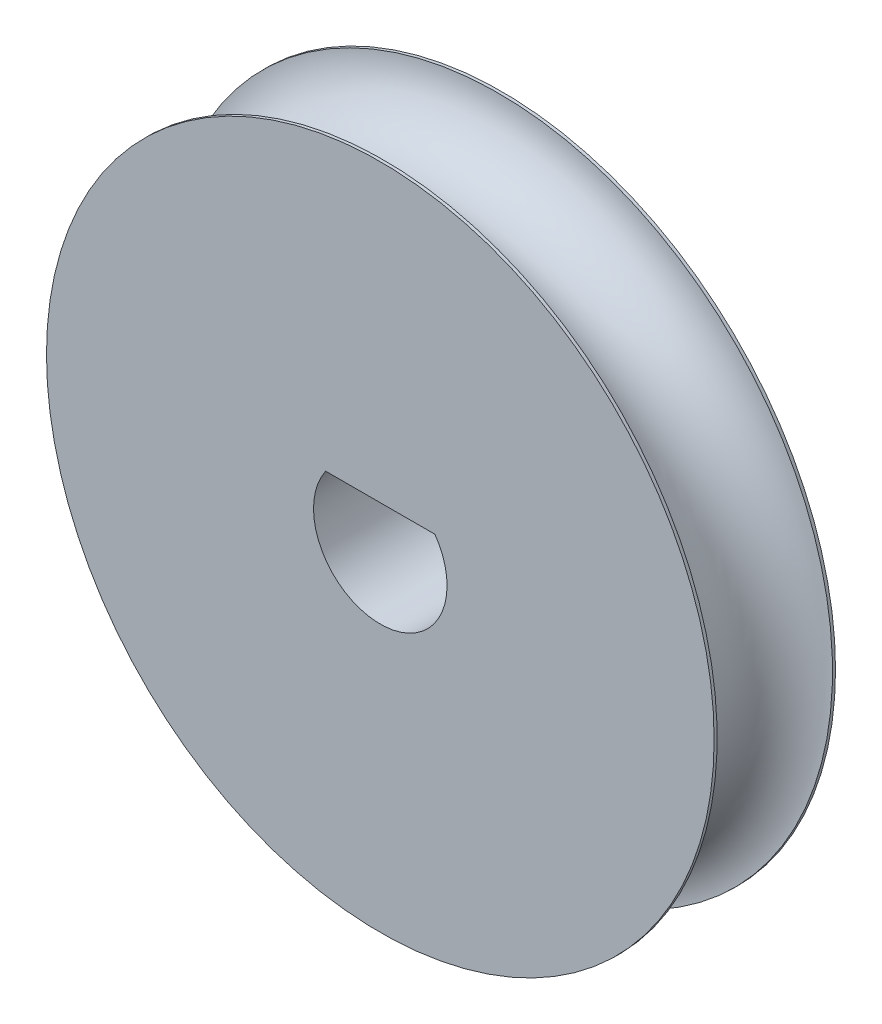
ISO-10303-21;
HEADER;
FILE_DESCRIPTION(('STEP AP214'),'2;1');
FILE_NAME('part.step','',(''),(''),'','','');
FILE_SCHEMA(('AUTOMOTIVE_DESIGN { 1 0 10303 214 1 1 1 1 }'));
ENDSEC;
DATA;
#1=APPLICATION_CONTEXT('core data for automotive mechanical design processes');
#2=APPLICATION_PROTOCOL_DEFINITION('international standard','automotive_design',2000,#1);
#3=PRODUCT_CONTEXT('',#1,'mechanical');
#4=PRODUCT('Part','Part','',(#3));
#5=PRODUCT_RELATED_PRODUCT_CATEGORY('part','',(#4));
#6=PRODUCT_DEFINITION_FORMATION('','',#4);
#7=PRODUCT_DEFINITION_CONTEXT('part definition',#1,'design');
#8=PRODUCT_DEFINITION('design','',#6,#7);
#9=PRODUCT_DEFINITION_SHAPE('','',#8);
#10=(LENGTH_UNIT() NAMED_UNIT(*) SI_UNIT(.MILLI.,.METRE.));
#11=(NAMED_UNIT(*) PLANE_ANGLE_UNIT() SI_UNIT($,.RADIAN.));
#12=(NAMED_UNIT(*) SI_UNIT($,.STERADIAN.) SOLID_ANGLE_UNIT());
#13=UNCERTAINTY_MEASURE_WITH_UNIT(LENGTH_MEASURE(1.E-05),#10,'distance_accuracy_value','');
#14=(GEOMETRIC_REPRESENTATION_CONTEXT(3) GLOBAL_UNCERTAINTY_ASSIGNED_CONTEXT((#13)) GLOBAL_UNIT_ASSIGNED_CONTEXT((#10,
#11,#12)) REPRESENTATION_CONTEXT('',''));
#15=CARTESIAN_POINT('',(0.,0.,0.));
#16=DIRECTION('',(0.,0.,1.));
#17=DIRECTION('',(1.,0.,0.));
#18=AXIS2_PLACEMENT_3D('',#15,#16,#17);
#19=CARTESIAN_POINT('',(0.,0.,2.));
#20=DIRECTION('',(0.,0.,-1.));
#21=DIRECTION('',(-1.,0.,0.));
#22=AXIS2_PLACEMENT_3D('',#19,#20,#21);
#23=CYLINDRICAL_SURFACE('',#22,5.5);
#24=CARTESIAN_POINT('',(0.,0.,0.05));
#25=DIRECTION('',(0.,0.,-1.));
#26=DIRECTION('',(-1.,0.,0.));
#27=AXIS2_PLACEMENT_3D('',#24,#25,#26);
#28=CIRCLE('',#27,5.5);
#29=CARTESIAN_POINT('',(-5.5,0.,0.05));
#30=VERTEX_POINT('',#29);
#31=EDGE_CURVE('E99',#30,#30,#28,.T.);
#32=ORIENTED_EDGE('',*,*,#31,.T.);
#33=EDGE_LOOP('',(#32));
#34=FACE_BOUND('',#33,.T.);
#35=CARTESIAN_POINT('',(0.,0.,0.));
#36=DIRECTION('',(0.,0.,1.));
#37=DIRECTION('',(1.,0.,0.));
#38=AXIS2_PLACEMENT_3D('',#35,#36,#37);
#39=CIRCLE('',#38,5.5);
#40=CARTESIAN_POINT('',(5.5,0.,0.));
#41=VERTEX_POINT('',#40);
#42=EDGE_CURVE('E45',#41,#41,#39,.T.);
#43=ORIENTED_EDGE('',*,*,#42,.T.);
#44=EDGE_LOOP('',(#43));
#45=FACE_BOUND('',#44,.T.);
#46=ADVANCED_FACE('F41',(#34,#45),#23,.T.);
#47=CARTESIAN_POINT('',(0.,0.,2.));
#48=DIRECTION('',(0.,0.,1.));
#49=DIRECTION('',(1.,0.,0.));
#50=AXIS2_PLACEMENT_3D('',#47,#48,#49);
#51=PLANE('',#50);
#52=CARTESIAN_POINT('',(0.,0.,2.));
#53=DIRECTION('',(0.,0.,1.));
#54=DIRECTION('',(1.,0.,0.));
#55=AXIS2_PLACEMENT_3D('',#52,#53,#54);
#56=CIRCLE('',#55,5.5);
#57=CARTESIAN_POINT('',(5.5,0.,2.));
#58=VERTEX_POINT('',#57);
#59=EDGE_CURVE('E11',#58,#58,#56,.T.);
#60=ORIENTED_EDGE('',*,*,#59,.T.);
#61=EDGE_LOOP('',(#60));
#62=FACE_BOUND('',#61,.T.);
#63=CARTESIAN_POINT('',(0.,0.,2.));
#64=DIRECTION('',(0.,0.,1.));
#65=DIRECTION('',(1.,0.,0.));
#66=AXIS2_PLACEMENT_3D('',#63,#64,#65);
#67=CIRCLE('',#66,1.1);
#68=CARTESIAN_POINT('',(-0.9,0.632455532033676,2.));
#69=VERTEX_POINT('',#68);
#70=CARTESIAN_POINT('',(0.9,0.632455532033676,2.));
#71=VERTEX_POINT('',#70);
#72=EDGE_CURVE('E79',#69,#71,#67,.T.);
#73=ORIENTED_EDGE('',*,*,#72,.F.);
#74=DIRECTION('',(1.,0.,0.));
#75=VECTOR('',#74,1.);
#76=CARTESIAN_POINT('',(-0.9,0.632455532033676,2.));
#77=LINE('',#76,#75);
#78=EDGE_CURVE('E69',#69,#71,#77,.T.);
#79=ORIENTED_EDGE('',*,*,#78,.T.);
#80=EDGE_LOOP('',(#73,#79));
#81=FACE_BOUND('',#80,.T.);
#82=ADVANCED_FACE('F78',(#62,#81),#51,.T.);
#83=CARTESIAN_POINT('',(0.,0.,0.));
#84=DIRECTION('',(0.,0.,1.));
#85=DIRECTION('',(1.,0.,0.));
#86=AXIS2_PLACEMENT_3D('',#83,#84,#85);
#87=PLANE('',#86);
#88=ORIENTED_EDGE('',*,*,#42,.F.);
#89=EDGE_LOOP('',(#88));
#90=FACE_BOUND('',#89,.T.);
#91=CARTESIAN_POINT('',(0.,0.,0.));
#92=DIRECTION('',(0.,0.,1.));
#93=DIRECTION('',(1.,0.,0.));
#94=AXIS2_PLACEMENT_3D('',#91,#92,#93);
#95=CIRCLE('',#94,1.1);
#96=CARTESIAN_POINT('',(-0.9,0.632455532033676,0.));
#97=VERTEX_POINT('',#96);
#98=CARTESIAN_POINT('',(0.9,0.632455532033676,0.));
#99=VERTEX_POINT('',#98);
#100=EDGE_CURVE('E85',#97,#99,#95,.T.);
#101=ORIENTED_EDGE('',*,*,#100,.T.);
#102=DIRECTION('',(-1.,0.,0.));
#103=VECTOR('',#102,1.);
#104=CARTESIAN_POINT('',(-0.9,0.632455532033676,0.));
#105=LINE('',#104,#103);
#106=EDGE_CURVE('E61',#99,#97,#105,.T.);
#107=ORIENTED_EDGE('',*,*,#106,.T.);
#108=EDGE_LOOP('',(#101,#107));
#109=FACE_BOUND('',#108,.T.);
#110=ADVANCED_FACE('F114',(#90,#109),#87,.F.);
#111=CARTESIAN_POINT('',(0.,0.,1.95));
#112=DIRECTION('',(0.,0.,-1.));
#113=DIRECTION('',(-1.,0.,0.));
#114=AXIS2_PLACEMENT_3D('',#111,#112,#113);
#115=CIRCLE('',#114,5.5);
#116=CARTESIAN_POINT('',(-5.5,0.,1.95));
#117=VERTEX_POINT('',#116);
#118=EDGE_CURVE('E81',#117,#117,#115,.T.);
#119=ORIENTED_EDGE('',*,*,#118,.F.);
#120=EDGE_LOOP('',(#119));
#121=FACE_BOUND('',#120,.T.);
#122=ORIENTED_EDGE('',*,*,#59,.F.);
#123=EDGE_LOOP('',(#122));
#124=FACE_BOUND('',#123,.T.);
#125=ADVANCED_FACE('F43',(#121,#124),#23,.T.);
#126=CARTESIAN_POINT('',(0.,0.,2.));
#127=DIRECTION('',(0.,0.,-1.));
#128=DIRECTION('',(-1.,0.,0.));
#129=AXIS2_PLACEMENT_3D('',#126,#127,#128);
#130=CYLINDRICAL_SURFACE('',#129,1.1);
#131=DIRECTION('',(0.,0.,1.));
#132=VECTOR('',#131,1.);
#133=CARTESIAN_POINT('',(-0.9,0.632455532033676,-1.85973057982223));
#134=LINE('',#133,#132);
#135=EDGE_CURVE('E57',#97,#69,#134,.T.);
#136=ORIENTED_EDGE('',*,*,#135,.T.);
#137=ORIENTED_EDGE('',*,*,#72,.T.);
#138=DIRECTION('',(0.,0.,1.));
#139=VECTOR('',#138,1.);
#140=CARTESIAN_POINT('',(0.9,0.632455532033676,-1.85973057982223));
#141=LINE('',#140,#139);
#142=EDGE_CURVE('E66',#99,#71,#141,.T.);
#143=ORIENTED_EDGE('',*,*,#142,.F.);
#144=ORIENTED_EDGE('',*,*,#100,.F.);
#145=EDGE_LOOP('',(#136,#137,#143,#144));
#146=FACE_BOUND('',#145,.T.);
#147=ADVANCED_FACE('F83',(#146),#130,.F.);
#148=CARTESIAN_POINT('',(-0.9,0.632455532033676,-1.85973057982223));
#149=DIRECTION('',(0.,-1.,0.));
#150=DIRECTION('',(0.,0.,-1.));
#151=AXIS2_PLACEMENT_3D('',#148,#149,#150);
#152=PLANE('',#151);
#153=ORIENTED_EDGE('',*,*,#106,.F.);
#154=ORIENTED_EDGE('',*,*,#142,.T.);
#155=ORIENTED_EDGE('',*,*,#78,.F.);
#156=ORIENTED_EDGE('',*,*,#135,.F.);
#157=EDGE_LOOP('',(#153,#154,#155,#156));
#158=FACE_BOUND('',#157,.T.);
#159=ADVANCED_FACE('F68',(#158),#152,.T.);
#160=CARTESIAN_POINT('',(0.,0.,1.));
#161=DIRECTION('',(0.,0.,-1.));
#162=DIRECTION('',(-1.,0.,0.));
#163=AXIS2_PLACEMENT_3D('',#160,#161,#162);
#164=TOROIDAL_SURFACE('',#163,5.5,0.95);
#165=ORIENTED_EDGE('',*,*,#31,.F.);
#166=EDGE_LOOP('',(#165));
#167=FACE_BOUND('',#166,.T.);
#168=ORIENTED_EDGE('',*,*,#118,.T.);
#169=EDGE_LOOP('',(#168));
#170=FACE_BOUND('',#169,.T.);
#171=ADVANCED_FACE('F106',(#167,#170),#164,.F.);
#172=CLOSED_SHELL('',(#46,#82,#110,#125,#147,#159,#171));
#173=MANIFOLD_SOLID_BREP('B2',#172);
#174=ADVANCED_BREP_SHAPE_REPRESENTATION('',(#18,#173),#14);
#175=SHAPE_DEFINITION_REPRESENTATION(#9,#174);
ENDSEC;
END-ISO-10303-21;
